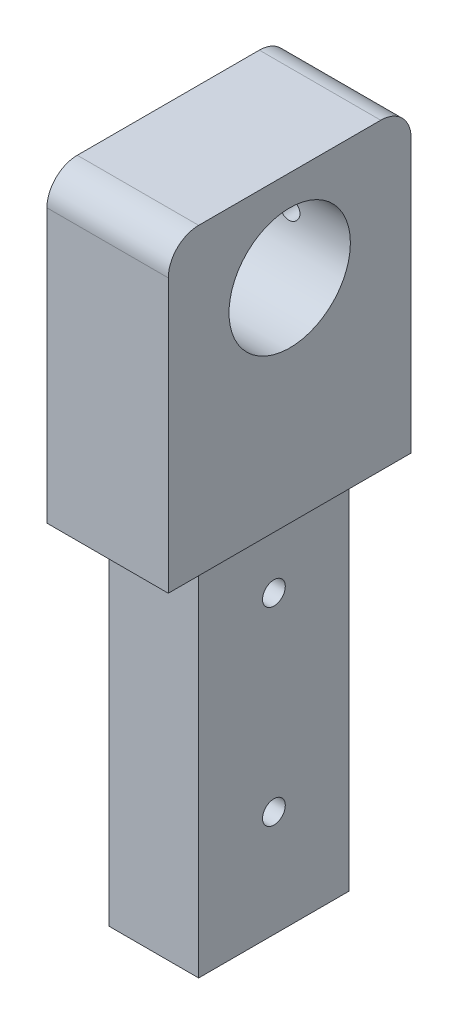
ISO-10303-21;
HEADER;
FILE_DESCRIPTION(('STEP AP214'),'2;1');
FILE_NAME('part.step','',(''),(''),'','','');
FILE_SCHEMA(('AUTOMOTIVE_DESIGN { 1 0 10303 214 1 1 1 1 }'));
ENDSEC;
DATA;
#1=APPLICATION_CONTEXT('core data for automotive mechanical design processes');
#2=APPLICATION_PROTOCOL_DEFINITION('international standard','automotive_design',2000,#1);
#3=PRODUCT_CONTEXT('',#1,'mechanical');
#4=PRODUCT('Part','Part','',(#3));
#5=PRODUCT_RELATED_PRODUCT_CATEGORY('part','',(#4));
#6=PRODUCT_DEFINITION_FORMATION('','',#4);
#7=PRODUCT_DEFINITION_CONTEXT('part definition',#1,'design');
#8=PRODUCT_DEFINITION('design','',#6,#7);
#9=PRODUCT_DEFINITION_SHAPE('','',#8);
#10=(LENGTH_UNIT() NAMED_UNIT(*) SI_UNIT(.MILLI.,.METRE.));
#11=(NAMED_UNIT(*) PLANE_ANGLE_UNIT() SI_UNIT($,.RADIAN.));
#12=(NAMED_UNIT(*) SI_UNIT($,.STERADIAN.) SOLID_ANGLE_UNIT());
#13=UNCERTAINTY_MEASURE_WITH_UNIT(LENGTH_MEASURE(1.E-05),#10,'distance_accuracy_value','');
#14=(GEOMETRIC_REPRESENTATION_CONTEXT(3) GLOBAL_UNCERTAINTY_ASSIGNED_CONTEXT((#13)) GLOBAL_UNIT_ASSIGNED_CONTEXT((#10,
#11,#12)) REPRESENTATION_CONTEXT('',''));
#15=CARTESIAN_POINT('',(0.,0.,0.));
#16=DIRECTION('',(0.,0.,1.));
#17=DIRECTION('',(1.,0.,0.));
#18=AXIS2_PLACEMENT_3D('',#15,#16,#17);
#19=CARTESIAN_POINT('',(0.,76.2,0.));
#20=DIRECTION('',(0.,-1.,0.));
#21=DIRECTION('',(0.,0.,-1.));
#22=AXIS2_PLACEMENT_3D('',#19,#20,#21);
#23=PLANE('',#22);
#24=DIRECTION('',(0.,0.,-1.));
#25=VECTOR('',#24,1.);
#26=CARTESIAN_POINT('',(12.7,76.2,25.4));
#27=LINE('',#26,#25);
#28=CARTESIAN_POINT('',(12.7,76.2,25.4));
#29=VERTEX_POINT('',#28);
#30=CARTESIAN_POINT('',(12.7,76.2,-25.4));
#31=VERTEX_POINT('',#30);
#32=EDGE_CURVE('E263',#29,#31,#27,.T.);
#33=ORIENTED_EDGE('',*,*,#32,.F.);
#34=DIRECTION('',(1.,0.,0.));
#35=VECTOR('',#34,1.);
#36=CARTESIAN_POINT('',(-12.7,76.2,25.4));
#37=LINE('',#36,#35);
#38=CARTESIAN_POINT('',(-12.7,76.2,25.4));
#39=VERTEX_POINT('',#38);
#40=EDGE_CURVE('E253',#39,#29,#37,.T.);
#41=ORIENTED_EDGE('',*,*,#40,.F.);
#42=DIRECTION('',(0.,0.,1.));
#43=VECTOR('',#42,1.);
#44=CARTESIAN_POINT('',(-12.7,76.2,25.4));
#45=LINE('',#44,#43);
#46=CARTESIAN_POINT('',(-12.7,76.2,-25.4));
#47=VERTEX_POINT('',#46);
#48=EDGE_CURVE('E257',#47,#39,#45,.T.);
#49=ORIENTED_EDGE('',*,*,#48,.F.);
#50=DIRECTION('',(-1.,0.,0.));
#51=VECTOR('',#50,1.);
#52=CARTESIAN_POINT('',(-12.7,76.2,-25.4));
#53=LINE('',#52,#51);
#54=EDGE_CURVE('E260',#31,#47,#53,.T.);
#55=ORIENTED_EDGE('',*,*,#54,.F.);
#56=EDGE_LOOP('',(#33,#41,#49,#55));
#57=FACE_BOUND('',#56,.T.);
#58=DIRECTION('',(-1.,0.,0.));
#59=VECTOR('',#58,1.);
#60=CARTESIAN_POINT('',(0.,76.2,15.748));
#61=LINE('',#60,#59);
#62=CARTESIAN_POINT('',(9.398,76.2,15.748));
#63=VERTEX_POINT('',#62);
#64=CARTESIAN_POINT('',(-9.398,76.2,15.748));
#65=VERTEX_POINT('',#64);
#66=EDGE_CURVE('E143',#63,#65,#61,.T.);
#67=ORIENTED_EDGE('',*,*,#66,.F.);
#68=DIRECTION('',(0.,0.,1.));
#69=VECTOR('',#68,1.);
#70=CARTESIAN_POINT('',(9.398,76.2,0.));
#71=LINE('',#70,#69);
#72=CARTESIAN_POINT('',(9.398,76.2,-15.748));
#73=VERTEX_POINT('',#72);
#74=EDGE_CURVE('E125',#73,#63,#71,.T.);
#75=ORIENTED_EDGE('',*,*,#74,.F.);
#76=DIRECTION('',(-1.,0.,0.));
#77=VECTOR('',#76,1.);
#78=CARTESIAN_POINT('',(0.,76.2,-15.748));
#79=LINE('',#78,#77);
#80=CARTESIAN_POINT('',(-9.398,76.2,-15.748));
#81=VERTEX_POINT('',#80);
#82=EDGE_CURVE('E124',#73,#81,#79,.T.);
#83=ORIENTED_EDGE('',*,*,#82,.T.);
#84=DIRECTION('',(0.,0.,1.));
#85=VECTOR('',#84,1.);
#86=CARTESIAN_POINT('',(-9.398,76.2,0.));
#87=LINE('',#86,#85);
#88=EDGE_CURVE('E111',#81,#65,#87,.T.);
#89=ORIENTED_EDGE('',*,*,#88,.T.);
#90=EDGE_LOOP('',(#67,#75,#83,#89));
#91=FACE_BOUND('',#90,.T.);
#92=ADVANCED_FACE('F34',(#57,#91),#23,.T.);
#93=CARTESIAN_POINT('',(12.7,139.7,25.4));
#94=DIRECTION('',(-1.,0.,0.));
#95=DIRECTION('',(0.,0.,1.));
#96=AXIS2_PLACEMENT_3D('',#93,#94,#95);
#97=PLANE('',#96);
#98=CARTESIAN_POINT('',(12.7,120.65,0.));
#99=DIRECTION('',(1.,0.,0.));
#100=DIRECTION('',(0.,0.,-1.));
#101=AXIS2_PLACEMENT_3D('',#98,#99,#100);
#102=CIRCLE('',#101,12.7);
#103=CARTESIAN_POINT('',(12.7,120.65,-12.7));
#104=VERTEX_POINT('',#103);
#105=EDGE_CURVE('E156',#104,#104,#102,.T.);
#106=ORIENTED_EDGE('',*,*,#105,.F.);
#107=EDGE_LOOP('',(#106));
#108=FACE_BOUND('',#107,.T.);
#109=DIRECTION('',(0.,-1.,0.));
#110=VECTOR('',#109,1.);
#111=CARTESIAN_POINT('',(12.7,139.7,-25.4));
#112=LINE('',#111,#110);
#113=CARTESIAN_POINT('',(12.7,133.35,-25.4));
#114=VERTEX_POINT('',#113);
#115=EDGE_CURVE('E244',#114,#31,#112,.T.);
#116=ORIENTED_EDGE('',*,*,#115,.F.);
#117=CARTESIAN_POINT('',(12.7,133.35,-19.05));
#118=DIRECTION('',(-1.,0.,0.));
#119=DIRECTION('',(0.,0.,1.));
#120=AXIS2_PLACEMENT_3D('',#117,#118,#119);
#121=CIRCLE('',#120,6.35);
#122=CARTESIAN_POINT('',(12.7,139.7,-19.05));
#123=VERTEX_POINT('',#122);
#124=EDGE_CURVE('E42',#114,#123,#121,.F.);
#125=ORIENTED_EDGE('',*,*,#124,.T.);
#126=DIRECTION('',(0.,0.,-1.));
#127=VECTOR('',#126,1.);
#128=CARTESIAN_POINT('',(12.7,139.7,25.4));
#129=LINE('',#128,#127);
#130=CARTESIAN_POINT('',(12.7,139.7,19.05));
#131=VERTEX_POINT('',#130);
#132=EDGE_CURVE('E256',#131,#123,#129,.T.);
#133=ORIENTED_EDGE('',*,*,#132,.F.);
#134=CARTESIAN_POINT('',(12.7,133.35,19.05));
#135=DIRECTION('',(-1.,0.,0.));
#136=DIRECTION('',(0.,0.,1.));
#137=AXIS2_PLACEMENT_3D('',#134,#135,#136);
#138=CIRCLE('',#137,6.35);
#139=CARTESIAN_POINT('',(12.7,133.35,25.4));
#140=VERTEX_POINT('',#139);
#141=EDGE_CURVE('E57',#131,#140,#138,.F.);
#142=ORIENTED_EDGE('',*,*,#141,.T.);
#143=DIRECTION('',(0.,-1.,0.));
#144=VECTOR('',#143,1.);
#145=CARTESIAN_POINT('',(12.7,139.7,25.4));
#146=LINE('',#145,#144);
#147=EDGE_CURVE('E250',#140,#29,#146,.T.);
#148=ORIENTED_EDGE('',*,*,#147,.T.);
#149=ORIENTED_EDGE('',*,*,#32,.T.);
#150=EDGE_LOOP('',(#116,#125,#133,#142,#148,#149));
#151=FACE_BOUND('',#150,.T.);
#152=ADVANCED_FACE('F189',(#108,#151),#97,.F.);
#153=CARTESIAN_POINT('',(-12.7,139.7,-25.4));
#154=DIRECTION('',(0.,0.,1.));
#155=DIRECTION('',(1.,0.,0.));
#156=AXIS2_PLACEMENT_3D('',#153,#154,#155);
#157=PLANE('',#156);
#158=CARTESIAN_POINT('',(0.,120.65,-25.4));
#159=DIRECTION('',(0.,0.,-1.));
#160=DIRECTION('',(-1.,0.,0.));
#161=AXIS2_PLACEMENT_3D('',#158,#159,#160);
#162=CIRCLE('',#161,2.15265);
#163=CARTESIAN_POINT('',(-2.15265,120.65,-25.4));
#164=VERTEX_POINT('',#163);
#165=EDGE_CURVE('E146',#164,#164,#162,.T.);
#166=ORIENTED_EDGE('',*,*,#165,.F.);
#167=EDGE_LOOP('',(#166));
#168=FACE_BOUND('',#167,.T.);
#169=DIRECTION('',(0.,-1.,0.));
#170=VECTOR('',#169,1.);
#171=CARTESIAN_POINT('',(-12.7,139.7,-25.4));
#172=LINE('',#171,#170);
#173=CARTESIAN_POINT('',(-12.7,133.35,-25.4));
#174=VERTEX_POINT('',#173);
#175=EDGE_CURVE('E246',#174,#47,#172,.T.);
#176=ORIENTED_EDGE('',*,*,#175,.F.);
#177=DIRECTION('',(-1.,0.,0.));
#178=VECTOR('',#177,1.);
#179=CARTESIAN_POINT('',(-12.7,133.35,-25.4));
#180=LINE('',#179,#178);
#181=EDGE_CURVE('E228',#174,#114,#180,.F.);
#182=ORIENTED_EDGE('',*,*,#181,.T.);
#183=ORIENTED_EDGE('',*,*,#115,.T.);
#184=ORIENTED_EDGE('',*,*,#54,.T.);
#185=EDGE_LOOP('',(#176,#182,#183,#184));
#186=FACE_BOUND('',#185,.T.);
#187=ADVANCED_FACE('F195',(#168,#186),#157,.F.);
#188=CARTESIAN_POINT('',(-12.7,139.7,25.4));
#189=DIRECTION('',(1.,0.,0.));
#190=DIRECTION('',(0.,0.,-1.));
#191=AXIS2_PLACEMENT_3D('',#188,#189,#190);
#192=PLANE('',#191);
#193=CARTESIAN_POINT('',(-12.7,120.65,0.));
#194=DIRECTION('',(1.,0.,0.));
#195=DIRECTION('',(0.,0.,-1.));
#196=AXIS2_PLACEMENT_3D('',#193,#194,#195);
#197=CIRCLE('',#196,12.7);
#198=CARTESIAN_POINT('',(-12.7,120.65,-12.7));
#199=VERTEX_POINT('',#198);
#200=EDGE_CURVE('E157',#199,#199,#197,.T.);
#201=ORIENTED_EDGE('',*,*,#200,.T.);
#202=EDGE_LOOP('',(#201));
#203=FACE_BOUND('',#202,.T.);
#204=DIRECTION('',(0.,0.,1.));
#205=VECTOR('',#204,1.);
#206=CARTESIAN_POINT('',(-12.7,139.7,25.4));
#207=LINE('',#206,#205);
#208=CARTESIAN_POINT('',(-12.7,139.7,-19.05));
#209=VERTEX_POINT('',#208);
#210=CARTESIAN_POINT('',(-12.7,139.7,19.05));
#211=VERTEX_POINT('',#210);
#212=EDGE_CURVE('E252',#209,#211,#207,.T.);
#213=ORIENTED_EDGE('',*,*,#212,.F.);
#214=CARTESIAN_POINT('',(-12.7,133.35,-19.05));
#215=DIRECTION('',(1.,0.,0.));
#216=DIRECTION('',(0.,0.,-1.));
#217=AXIS2_PLACEMENT_3D('',#214,#215,#216);
#218=CIRCLE('',#217,6.35);
#219=EDGE_CURVE('E236',#209,#174,#218,.F.);
#220=ORIENTED_EDGE('',*,*,#219,.T.);
#221=ORIENTED_EDGE('',*,*,#175,.T.);
#222=ORIENTED_EDGE('',*,*,#48,.T.);
#223=DIRECTION('',(0.,-1.,0.));
#224=VECTOR('',#223,1.);
#225=CARTESIAN_POINT('',(-12.7,139.7,25.4));
#226=LINE('',#225,#224);
#227=CARTESIAN_POINT('',(-12.7,133.35,25.4));
#228=VERTEX_POINT('',#227);
#229=EDGE_CURVE('E248',#228,#39,#226,.T.);
#230=ORIENTED_EDGE('',*,*,#229,.F.);
#231=CARTESIAN_POINT('',(-12.7,133.35,19.05));
#232=DIRECTION('',(1.,0.,0.));
#233=DIRECTION('',(0.,0.,-1.));
#234=AXIS2_PLACEMENT_3D('',#231,#232,#233);
#235=CIRCLE('',#234,6.35);
#236=EDGE_CURVE('E238',#228,#211,#235,.F.);
#237=ORIENTED_EDGE('',*,*,#236,.T.);
#238=EDGE_LOOP('',(#213,#220,#221,#222,#230,#237));
#239=FACE_BOUND('',#238,.T.);
#240=ADVANCED_FACE('F205',(#203,#239),#192,.F.);
#241=CARTESIAN_POINT('',(-12.7,139.7,25.4));
#242=DIRECTION('',(0.,0.,-1.));
#243=DIRECTION('',(-1.,0.,0.));
#244=AXIS2_PLACEMENT_3D('',#241,#242,#243);
#245=PLANE('',#244);
#246=ORIENTED_EDGE('',*,*,#147,.F.);
#247=DIRECTION('',(1.,0.,0.));
#248=VECTOR('',#247,1.);
#249=CARTESIAN_POINT('',(-12.7,133.35,25.4));
#250=LINE('',#249,#248);
#251=EDGE_CURVE('E11',#140,#228,#250,.F.);
#252=ORIENTED_EDGE('',*,*,#251,.T.);
#253=ORIENTED_EDGE('',*,*,#229,.T.);
#254=ORIENTED_EDGE('',*,*,#40,.T.);
#255=EDGE_LOOP('',(#246,#252,#253,#254));
#256=FACE_BOUND('',#255,.T.);
#257=ADVANCED_FACE('F202',(#256),#245,.F.);
#258=CARTESIAN_POINT('',(0.,139.7,0.));
#259=DIRECTION('',(0.,-1.,0.));
#260=DIRECTION('',(0.,0.,-1.));
#261=AXIS2_PLACEMENT_3D('',#258,#259,#260);
#262=PLANE('',#261);
#263=ORIENTED_EDGE('',*,*,#132,.T.);
#264=DIRECTION('',(-1.,0.,0.));
#265=VECTOR('',#264,1.);
#266=CARTESIAN_POINT('',(0.,139.7,-19.05));
#267=LINE('',#266,#265);
#268=EDGE_CURVE('E230',#123,#209,#267,.T.);
#269=ORIENTED_EDGE('',*,*,#268,.T.);
#270=ORIENTED_EDGE('',*,*,#212,.T.);
#271=DIRECTION('',(1.,0.,0.));
#272=VECTOR('',#271,1.);
#273=CARTESIAN_POINT('',(0.,139.7,19.05));
#274=LINE('',#273,#272);
#275=EDGE_CURVE('E241',#211,#131,#274,.T.);
#276=ORIENTED_EDGE('',*,*,#275,.T.);
#277=EDGE_LOOP('',(#263,#269,#270,#276));
#278=FACE_BOUND('',#277,.T.);
#279=ADVANCED_FACE('F201',(#278),#262,.F.);
#280=CARTESIAN_POINT('',(0.,133.35,-19.05));
#281=DIRECTION('',(-1.,0.,0.));
#282=DIRECTION('',(0.,0.,1.));
#283=AXIS2_PLACEMENT_3D('',#280,#281,#282);
#284=CYLINDRICAL_SURFACE('',#283,6.35);
#285=ORIENTED_EDGE('',*,*,#124,.F.);
#286=ORIENTED_EDGE('',*,*,#181,.F.);
#287=ORIENTED_EDGE('',*,*,#219,.F.);
#288=ORIENTED_EDGE('',*,*,#268,.F.);
#289=EDGE_LOOP('',(#285,#286,#287,#288));
#290=FACE_BOUND('',#289,.T.);
#291=ADVANCED_FACE('F215',(#290),#284,.T.);
#292=CARTESIAN_POINT('',(0.,133.35,19.05));
#293=DIRECTION('',(1.,0.,0.));
#294=DIRECTION('',(0.,0.,-1.));
#295=AXIS2_PLACEMENT_3D('',#292,#293,#294);
#296=CYLINDRICAL_SURFACE('',#295,6.35);
#297=ORIENTED_EDGE('',*,*,#236,.F.);
#298=ORIENTED_EDGE('',*,*,#251,.F.);
#299=ORIENTED_EDGE('',*,*,#141,.F.);
#300=ORIENTED_EDGE('',*,*,#275,.F.);
#301=EDGE_LOOP('',(#297,#298,#299,#300));
#302=FACE_BOUND('',#301,.T.);
#303=ADVANCED_FACE('F36',(#302),#296,.T.);
#304=CARTESIAN_POINT('',(-12.7,120.65,0.));
#305=DIRECTION('',(1.,0.,0.));
#306=DIRECTION('',(0.,0.,-1.));
#307=AXIS2_PLACEMENT_3D('',#304,#305,#306);
#308=CYLINDRICAL_SURFACE('',#307,12.7);
#309=CARTESIAN_POINT('',(-2.15265,120.65,-12.7));
#310=CARTESIAN_POINT('',(-2.15264521569791,120.530006298646,-12.699997924655));
#311=CARTESIAN_POINT('',(-2.1425830149563,120.409947860943,-12.6982816971202));
#312=CARTESIAN_POINT('',(-2.10261799133396,120.173200311392,-12.6916006090816));
#313=CARTESIAN_POINT('',(-2.07269711763207,120.056514365809,-12.6866327930575));
#314=CARTESIAN_POINT('',(-1.99394582791418,119.829971127921,-12.6740055416238));
#315=CARTESIAN_POINT('',(-1.94513108992905,119.720108261343,-12.6663483383404));
#316=CARTESIAN_POINT('',(-1.83001925322609,119.510145866349,-12.6491834953183));
#317=CARTESIAN_POINT('',(-1.76372407761835,119.410045265596,-12.6396760591631));
#318=CARTESIAN_POINT('',(-1.61483711826864,119.221447017152,-12.6197591583024));
#319=CARTESIAN_POINT('',(-1.53210647721695,119.133059740743,-12.6093424637949));
#320=CARTESIAN_POINT('',(-1.35299586734683,118.971350712469,-12.5888361898486));
#321=CARTESIAN_POINT('',(-1.25661502289999,118.898029927826,-12.578746631446));
#322=CARTESIAN_POINT('',(-1.05217888262665,118.76809069061,-12.5599669596967));
#323=CARTESIAN_POINT('',(-0.944053024652442,118.711581787232,-12.5512861858316));
#324=CARTESIAN_POINT('',(-0.719671953405707,118.617571037699,-12.5364074652641));
#325=CARTESIAN_POINT('',(-0.603417309278593,118.580067862351,-12.5302093449403));
#326=CARTESIAN_POINT('',(-0.36725014008277,118.525481740197,-12.521069779767));
#327=CARTESIAN_POINT('',(-0.247382915742406,118.50820798814,-12.5180979243859));
#328=CARTESIAN_POINT('',(-0.00641741593518925,118.493979372627,-12.5156554210272));
#329=CARTESIAN_POINT('',(0.114680768777181,118.497023021934,-12.5161845167791));
#330=CARTESIAN_POINT('',(0.35330598106701,118.523187484942,-12.5206563793401));
#331=CARTESIAN_POINT('',(0.470857331366284,118.546093619107,-12.5245626433926));
#332=CARTESIAN_POINT('',(0.700423922620427,118.610995771892,-12.5352915403332));
#333=CARTESIAN_POINT('',(0.812438967617116,118.652992465689,-12.5421142763678));
#334=CARTESIAN_POINT('',(1.02839404990791,118.75510025756,-12.5579466335029));
#335=CARTESIAN_POINT('',(1.13229127304949,118.815300182156,-12.5669669351715));
#336=CARTESIAN_POINT('',(1.32859082454557,118.952042547154,-12.5861706944476));
#337=CARTESIAN_POINT('',(1.42099219305693,119.028586350737,-12.5963542490445));
#338=CARTESIAN_POINT('',(1.59291947260541,119.197011776318,-12.6168973037264));
#339=CARTESIAN_POINT('',(1.67226505514618,119.289077518077,-12.6272573853007));
#340=CARTESIAN_POINT('',(1.81440923333887,119.485311566517,-12.6468655373414));
#341=CARTESIAN_POINT('',(1.87720771548087,119.589479956213,-12.6561136001792));
#342=CARTESIAN_POINT('',(1.98449278841322,119.807134292884,-12.6724695158738));
#343=CARTESIAN_POINT('',(2.02896308417802,119.920628424047,-12.6795754627405));
#344=CARTESIAN_POINT('',(2.09816015761148,120.153622075608,-12.6908312775343));
#345=CARTESIAN_POINT('',(2.12288864428317,120.273121075228,-12.6949814013367));
#346=CARTESIAN_POINT('',(2.15165484616626,120.513178431699,-12.6998234607268));
#347=CARTESIAN_POINT('',(2.1559400528431,120.633706326102,-12.7005567587157));
#348=CARTESIAN_POINT('',(2.14435839886969,120.8737576859,-12.6985959571487));
#349=CARTESIAN_POINT('',(2.12849234113981,120.993281191124,-12.6959019941509));
#350=CARTESIAN_POINT('',(2.07726438091067,121.227163824306,-12.6874149953279));
#351=CARTESIAN_POINT('',(2.04202535697163,121.341550637048,-12.6816414991218));
#352=CARTESIAN_POINT('',(1.95318301945154,121.562792879538,-12.6676401846811));
#353=CARTESIAN_POINT('',(1.89957864545212,121.669647873969,-12.659412224729));
#354=CARTESIAN_POINT('',(1.77496287994788,121.873865854442,-12.6413120190352));
#355=CARTESIAN_POINT('',(1.70379732659813,121.971133477432,-12.6314254737356));
#356=CARTESIAN_POINT('',(1.54629094516507,122.152434179993,-12.6111470118822));
#357=CARTESIAN_POINT('',(1.45994897458953,122.236466262277,-12.6007550573234));
#358=CARTESIAN_POINT('',(1.27342929706948,122.389830918727,-12.5805028160375));
#359=CARTESIAN_POINT('',(1.17311304349881,122.458996051027,-12.57064943245));
#360=CARTESIAN_POINT('',(0.962140427344523,122.579493042892,-12.5527201526261));
#361=CARTESIAN_POINT('',(0.851484400725226,122.630825481629,-12.5446441986652));
#362=CARTESIAN_POINT('',(0.623435947736227,122.713951191478,-12.5312362762397));
#363=CARTESIAN_POINT('',(0.506074299801619,122.745826950014,-12.5258927394491));
#364=CARTESIAN_POINT('',(0.267564172942973,122.78939342253,-12.5185259687774));
#365=CARTESIAN_POINT('',(0.146416036671309,122.801085957607,-12.5165024353392));
#366=CARTESIAN_POINT('',(-0.0945554571032056,122.803901961008,-12.5160179945158));
#367=CARTESIAN_POINT('',(-0.214375723377884,122.795289056344,-12.5175114258408));
#368=CARTESIAN_POINT('',(-0.450835696296917,122.758309638542,-12.5237924174687));
#369=CARTESIAN_POINT('',(-0.567475414280441,122.729943195837,-12.5285799660259));
#370=CARTESIAN_POINT('',(-0.79415619503027,122.654364269091,-12.5408921577297));
#371=CARTESIAN_POINT('',(-0.9042052763161,122.607175244328,-12.54841339275));
#372=CARTESIAN_POINT('',(-1.11486715754801,122.495317963694,-12.5653486794714));
#373=CARTESIAN_POINT('',(-1.21547946286594,122.430648792291,-12.5747628303085));
#374=CARTESIAN_POINT('',(-1.40574225667553,122.284729213607,-12.5945675841662));
#375=CARTESIAN_POINT('',(-1.4952431219012,122.203285119387,-12.604968749501));
#376=CARTESIAN_POINT('',(-1.65939778245155,122.02653549881,-12.6254920298366));
#377=CARTESIAN_POINT('',(-1.73404814984292,121.931226780859,-12.6356140799461));
#378=CARTESIAN_POINT('',(-1.86687336471781,121.72864040438,-12.6545228762308));
#379=CARTESIAN_POINT('',(-1.92492628429852,121.621281851993,-12.6632995312268));
#380=CARTESIAN_POINT('',(-2.02208350885933,121.39823023787,-12.6784304467392));
#381=CARTESIAN_POINT('',(-2.06120654791025,121.282545546969,-12.6847871008901));
#382=CARTESIAN_POINT('',(-2.11097207888548,121.080353999692,-12.6929863246093));
#383=CARTESIAN_POINT('',(-2.12657605493461,120.99506533139,-12.6956022929582));
#384=CARTESIAN_POINT('',(-2.14741664800654,120.823195669668,-12.6991098640049));
#385=CARTESIAN_POINT('',(-2.15265345343867,120.736614699763,-12.7000014980402));
#386=CARTESIAN_POINT('',(-2.15265,120.65,-12.7));
#387=B_SPLINE_CURVE_WITH_KNOTS('',3,(#309,#310,#311,#312,#313,#314,#315,#316,#317,#318,#319,
#320,#321,#322,#323,#324,#325,#326,#327,#328,#329,#330,#331,#332,#333,#334,#335,#336,#337,#338,
#339,#340,#341,#342,#343,#344,#345,#346,#347,#348,#349,#350,#351,#352,#353,#354,#355,#356,#357,
#358,#359,#360,#361,#362,#363,#364,#365,#366,#367,#368,#369,#370,#371,#372,#373,#374,#375,#376,
#377,#378,#379,#380,#381,#382,#383,#384,#385,#386),.UNSPECIFIED.,.T.,.F.,(4,2,2,2,2,2,2,2,2,2,2,
2,2,2,2,2,2,2,2,2,2,2,2,2,2,2,2,2,2,2,2,2,2,2,2,2,2,2,4),(0.,0.359664482712598,
0.719656336084686,1.07935010829272,1.43900432529436,1.8018373141574,2.16469358845302,
2.52986496472286,2.89501079869204,3.25668408340223,3.61833089384127,3.97611696360601,
4.33391568819509,4.69348934236995,5.05309299892565,5.41730863180249,5.78152676306329,
6.14606801452232,6.51057770506052,6.87066315559292,7.23073425909154,7.5885474265767,
7.94638125773659,8.30747566629145,8.66859726995953,9.03359461183655,9.3985800981856,
9.76200726623957,10.125401641199,10.4841040724102,10.842805224622,11.2010607043238,
11.5593349514874,11.9220045380721,12.2847577426139,12.6501110757777,13.0151020914752,
13.2747223632014,13.5343379166365),.UNSPECIFIED.);
#388=CARTESIAN_POINT('',(-2.15265,120.65,-12.7));
#389=VERTEX_POINT('',#388);
#390=EDGE_CURVE('E149',#389,#389,#387,.T.);
#391=ORIENTED_EDGE('',*,*,#390,.F.);
#392=EDGE_LOOP('',(#391));
#393=FACE_BOUND('',#392,.T.);
#394=ORIENTED_EDGE('',*,*,#200,.F.);
#395=EDGE_LOOP('',(#394));
#396=FACE_BOUND('',#395,.T.);
#397=ORIENTED_EDGE('',*,*,#105,.T.);
#398=EDGE_LOOP('',(#397));
#399=FACE_BOUND('',#398,.T.);
#400=ADVANCED_FACE('F222',(#393,#396,#399),#308,.F.);
#401=CARTESIAN_POINT('',(0.,120.65,25.401));
#402=DIRECTION('',(0.,0.,-1.));
#403=DIRECTION('',(-1.,0.,0.));
#404=AXIS2_PLACEMENT_3D('',#401,#402,#403);
#405=CYLINDRICAL_SURFACE('',#404,2.15265);
#406=ORIENTED_EDGE('',*,*,#390,.T.);
#407=EDGE_LOOP('',(#406));
#408=FACE_BOUND('',#407,.T.);
#409=ORIENTED_EDGE('',*,*,#165,.T.);
#410=EDGE_LOOP('',(#409));
#411=FACE_BOUND('',#410,.T.);
#412=ADVANCED_FACE('F159',(#408,#411),#405,.F.);
#413=CARTESIAN_POINT('',(0.,115.670651983467,15.748));
#414=DIRECTION('',(0.,0.,-1.));
#415=DIRECTION('',(-1.,0.,0.));
#416=AXIS2_PLACEMENT_3D('',#413,#414,#415);
#417=PLANE('',#416);
#418=ORIENTED_EDGE('',*,*,#66,.T.);
#419=DIRECTION('',(0.,-1.,0.));
#420=VECTOR('',#419,1.);
#421=CARTESIAN_POINT('',(-9.398,115.670651983467,15.748));
#422=LINE('',#421,#420);
#423=CARTESIAN_POINT('',(-9.398,0.,15.748));
#424=VERTEX_POINT('',#423);
#425=EDGE_CURVE('E118',#65,#424,#422,.T.);
#426=ORIENTED_EDGE('',*,*,#425,.T.);
#427=DIRECTION('',(1.,0.,0.));
#428=VECTOR('',#427,1.);
#429=CARTESIAN_POINT('',(0.,0.,15.748));
#430=LINE('',#429,#428);
#431=CARTESIAN_POINT('',(9.398,0.,15.748));
#432=VERTEX_POINT('',#431);
#433=EDGE_CURVE('E49',#424,#432,#430,.T.);
#434=ORIENTED_EDGE('',*,*,#433,.T.);
#435=DIRECTION('',(0.,-1.,0.));
#436=VECTOR('',#435,1.);
#437=CARTESIAN_POINT('',(9.398,115.670651983467,15.748));
#438=LINE('',#437,#436);
#439=EDGE_CURVE('E121',#63,#432,#438,.T.);
#440=ORIENTED_EDGE('',*,*,#439,.F.);
#441=EDGE_LOOP('',(#418,#426,#434,#440));
#442=FACE_BOUND('',#441,.T.);
#443=ADVANCED_FACE('F164',(#442),#417,.F.);
#444=CARTESIAN_POINT('',(-9.398,115.670651983467,0.));
#445=DIRECTION('',(-1.,0.,0.));
#446=DIRECTION('',(0.,0.,1.));
#447=AXIS2_PLACEMENT_3D('',#444,#445,#446);
#448=PLANE('',#447);
#449=CARTESIAN_POINT('',(-9.398,22.225,-1.37390099297363E-12));
#450=DIRECTION('',(-1.,0.,0.));
#451=DIRECTION('',(0.,0.,1.));
#452=AXIS2_PLACEMENT_3D('',#449,#450,#451);
#453=CIRCLE('',#452,2.38125000000004);
#454=CARTESIAN_POINT('',(-9.398,22.225,2.38124999999866));
#455=VERTEX_POINT('',#454);
#456=EDGE_CURVE('E409',#455,#455,#453,.T.);
#457=ORIENTED_EDGE('',*,*,#456,.F.);
#458=EDGE_LOOP('',(#457));
#459=FACE_BOUND('',#458,.T.);
#460=CARTESIAN_POINT('',(-9.398,61.9125,-1.37390099297363E-12));
#461=DIRECTION('',(-1.,0.,0.));
#462=DIRECTION('',(0.,0.,1.));
#463=AXIS2_PLACEMENT_3D('',#460,#461,#462);
#464=CIRCLE('',#463,2.38125000000004);
#465=CARTESIAN_POINT('',(-9.398,61.9125,2.38124999999866));
#466=VERTEX_POINT('',#465);
#467=EDGE_CURVE('E142',#466,#466,#464,.T.);
#468=ORIENTED_EDGE('',*,*,#467,.F.);
#469=EDGE_LOOP('',(#468));
#470=FACE_BOUND('',#469,.T.);
#471=DIRECTION('',(0.,-1.,0.));
#472=VECTOR('',#471,1.);
#473=CARTESIAN_POINT('',(-9.398,115.670651983467,-15.748));
#474=LINE('',#473,#472);
#475=CARTESIAN_POINT('',(-9.398,0.,-15.748));
#476=VERTEX_POINT('',#475);
#477=EDGE_CURVE('E116',#81,#476,#474,.T.);
#478=ORIENTED_EDGE('',*,*,#477,.T.);
#479=DIRECTION('',(0.,0.,-1.));
#480=VECTOR('',#479,1.);
#481=CARTESIAN_POINT('',(-9.398,0.,0.));
#482=LINE('',#481,#480);
#483=EDGE_CURVE('E128',#424,#476,#482,.T.);
#484=ORIENTED_EDGE('',*,*,#483,.F.);
#485=ORIENTED_EDGE('',*,*,#425,.F.);
#486=ORIENTED_EDGE('',*,*,#88,.F.);
#487=EDGE_LOOP('',(#478,#484,#485,#486));
#488=FACE_BOUND('',#487,.T.);
#489=ADVANCED_FACE('F113',(#459,#470,#488),#448,.T.);
#490=CARTESIAN_POINT('',(0.,115.670651983467,-15.748));
#491=DIRECTION('',(0.,0.,-1.));
#492=DIRECTION('',(-1.,0.,0.));
#493=AXIS2_PLACEMENT_3D('',#490,#491,#492);
#494=PLANE('',#493);
#495=DIRECTION('',(0.,-1.,0.));
#496=VECTOR('',#495,1.);
#497=CARTESIAN_POINT('',(9.398,115.670651983467,-15.748));
#498=LINE('',#497,#496);
#499=CARTESIAN_POINT('',(9.398,0.,-15.748));
#500=VERTEX_POINT('',#499);
#501=EDGE_CURVE('E135',#73,#500,#498,.T.);
#502=ORIENTED_EDGE('',*,*,#501,.T.);
#503=DIRECTION('',(1.,0.,0.));
#504=VECTOR('',#503,1.);
#505=CARTESIAN_POINT('',(0.,0.,-15.748));
#506=LINE('',#505,#504);
#507=EDGE_CURVE('E132',#476,#500,#506,.T.);
#508=ORIENTED_EDGE('',*,*,#507,.F.);
#509=ORIENTED_EDGE('',*,*,#477,.F.);
#510=ORIENTED_EDGE('',*,*,#82,.F.);
#511=EDGE_LOOP('',(#502,#508,#509,#510));
#512=FACE_BOUND('',#511,.T.);
#513=ADVANCED_FACE('F130',(#512),#494,.T.);
#514=CARTESIAN_POINT('',(9.398,115.670651983467,0.));
#515=DIRECTION('',(-1.,0.,0.));
#516=DIRECTION('',(0.,0.,1.));
#517=AXIS2_PLACEMENT_3D('',#514,#515,#516);
#518=PLANE('',#517);
#519=CARTESIAN_POINT('',(9.398,22.225,-1.37390099297363E-12));
#520=DIRECTION('',(1.,0.,0.));
#521=DIRECTION('',(0.,0.,-1.));
#522=AXIS2_PLACEMENT_3D('',#519,#520,#521);
#523=CIRCLE('',#522,2.38125000000004);
#524=CARTESIAN_POINT('',(9.398,22.225,-2.38125000000141));
#525=VERTEX_POINT('',#524);
#526=EDGE_CURVE('E411',#525,#525,#523,.T.);
#527=ORIENTED_EDGE('',*,*,#526,.F.);
#528=EDGE_LOOP('',(#527));
#529=FACE_BOUND('',#528,.T.);
#530=CARTESIAN_POINT('',(9.398,61.9125,-1.37390099297363E-12));
#531=DIRECTION('',(1.,0.,0.));
#532=DIRECTION('',(0.,0.,-1.));
#533=AXIS2_PLACEMENT_3D('',#530,#531,#532);
#534=CIRCLE('',#533,2.38125000000004);
#535=CARTESIAN_POINT('',(9.398,61.9125,-2.38125000000141));
#536=VERTEX_POINT('',#535);
#537=EDGE_CURVE('E406',#536,#536,#534,.T.);
#538=ORIENTED_EDGE('',*,*,#537,.F.);
#539=EDGE_LOOP('',(#538));
#540=FACE_BOUND('',#539,.T.);
#541=ORIENTED_EDGE('',*,*,#74,.T.);
#542=ORIENTED_EDGE('',*,*,#439,.T.);
#543=DIRECTION('',(0.,0.,-1.));
#544=VECTOR('',#543,1.);
#545=CARTESIAN_POINT('',(9.398,0.,0.));
#546=LINE('',#545,#544);
#547=EDGE_CURVE('E144',#432,#500,#546,.T.);
#548=ORIENTED_EDGE('',*,*,#547,.T.);
#549=ORIENTED_EDGE('',*,*,#501,.F.);
#550=EDGE_LOOP('',(#541,#542,#548,#549));
#551=FACE_BOUND('',#550,.T.);
#552=ADVANCED_FACE('F172',(#529,#540,#551),#518,.F.);
#553=CARTESIAN_POINT('',(0.,0.,0.));
#554=DIRECTION('',(0.,-1.,0.));
#555=DIRECTION('',(0.,0.,-1.));
#556=AXIS2_PLACEMENT_3D('',#553,#554,#555);
#557=PLANE('',#556);
#558=ORIENTED_EDGE('',*,*,#433,.F.);
#559=ORIENTED_EDGE('',*,*,#483,.T.);
#560=ORIENTED_EDGE('',*,*,#507,.T.);
#561=ORIENTED_EDGE('',*,*,#547,.F.);
#562=EDGE_LOOP('',(#558,#559,#560,#561));
#563=FACE_BOUND('',#562,.T.);
#564=ADVANCED_FACE('F175',(#563),#557,.T.);
#565=CARTESIAN_POINT('',(-69.342,61.9125,-1.37390099297363E-12));
#566=DIRECTION('',(1.,0.,0.));
#567=DIRECTION('',(0.,0.,-1.));
#568=AXIS2_PLACEMENT_3D('',#565,#566,#567);
#569=CYLINDRICAL_SURFACE('',#568,2.38125000000004);
#570=ORIENTED_EDGE('',*,*,#467,.T.);
#571=EDGE_LOOP('',(#570));
#572=FACE_BOUND('',#571,.T.);
#573=ORIENTED_EDGE('',*,*,#537,.T.);
#574=EDGE_LOOP('',(#573));
#575=FACE_BOUND('',#574,.T.);
#576=ADVANCED_FACE('F177',(#572,#575),#569,.F.);
#577=CARTESIAN_POINT('',(-69.342,22.225,-1.37390099297363E-12));
#578=DIRECTION('',(1.,0.,0.));
#579=DIRECTION('',(0.,0.,-1.));
#580=AXIS2_PLACEMENT_3D('',#577,#578,#579);
#581=CYLINDRICAL_SURFACE('',#580,2.38125000000004);
#582=ORIENTED_EDGE('',*,*,#456,.T.);
#583=EDGE_LOOP('',(#582));
#584=FACE_BOUND('',#583,.T.);
#585=ORIENTED_EDGE('',*,*,#526,.T.);
#586=EDGE_LOOP('',(#585));
#587=FACE_BOUND('',#586,.T.);
#588=ADVANCED_FACE('F180',(#584,#587),#581,.F.);
#589=CLOSED_SHELL('',(#92,#152,#187,#240,#257,#279,#291,#303,#400,#412,#443,#489,#513,#552,#564,
#576,#588));
#590=MANIFOLD_SOLID_BREP('B2',#589);
#591=ADVANCED_BREP_SHAPE_REPRESENTATION('',(#18,#590),#14);
#592=SHAPE_DEFINITION_REPRESENTATION(#9,#591);
ENDSEC;
END-ISO-10303-21;
